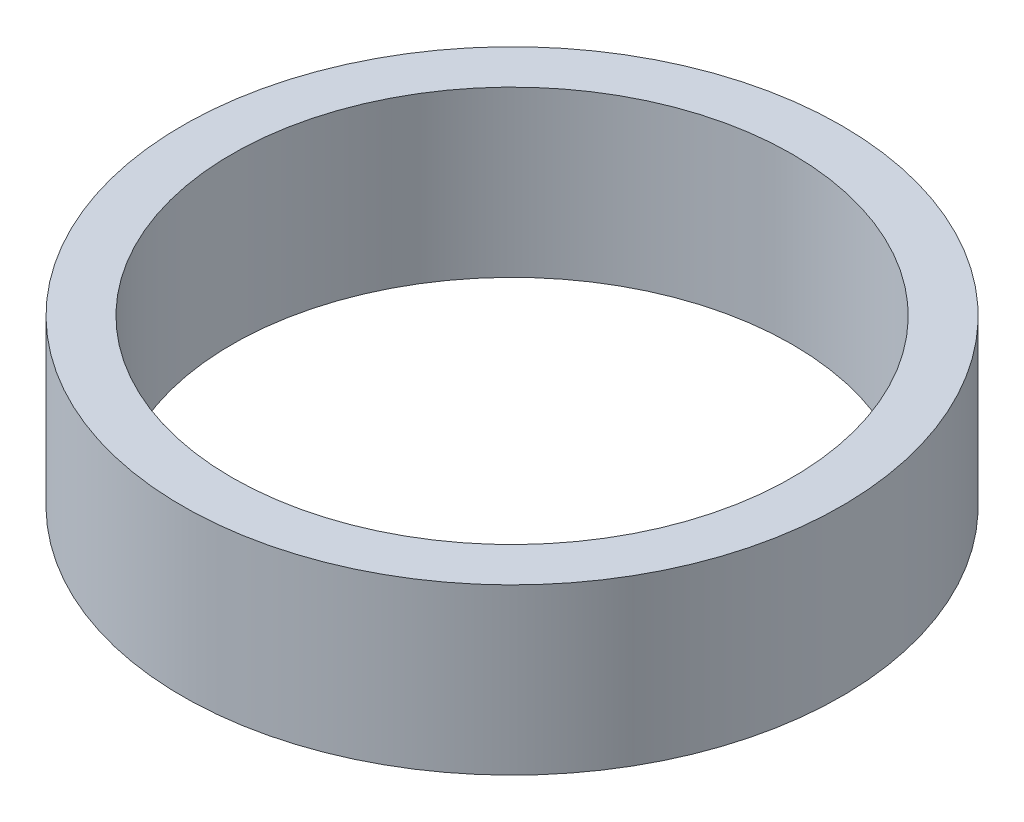
ISO-10303-21;
HEADER;
FILE_DESCRIPTION(('STEP AP214'),'2;1');
FILE_NAME('part.step','',(''),(''),'','','');
FILE_SCHEMA(('AUTOMOTIVE_DESIGN { 1 0 10303 214 1 1 1 1 }'));
ENDSEC;
DATA;
#1=APPLICATION_CONTEXT('core data for automotive mechanical design processes');
#2=APPLICATION_PROTOCOL_DEFINITION('international standard','automotive_design',2000,#1);
#3=PRODUCT_CONTEXT('',#1,'mechanical');
#4=PRODUCT('Part','Part','',(#3));
#5=PRODUCT_RELATED_PRODUCT_CATEGORY('part','',(#4));
#6=PRODUCT_DEFINITION_FORMATION('','',#4);
#7=PRODUCT_DEFINITION_CONTEXT('part definition',#1,'design');
#8=PRODUCT_DEFINITION('design','',#6,#7);
#9=PRODUCT_DEFINITION_SHAPE('','',#8);
#10=(LENGTH_UNIT() NAMED_UNIT(*) SI_UNIT(.MILLI.,.METRE.));
#11=(NAMED_UNIT(*) PLANE_ANGLE_UNIT() SI_UNIT($,.RADIAN.));
#12=(NAMED_UNIT(*) SI_UNIT($,.STERADIAN.) SOLID_ANGLE_UNIT());
#13=UNCERTAINTY_MEASURE_WITH_UNIT(LENGTH_MEASURE(1.E-05),#10,'distance_accuracy_value','');
#14=(GEOMETRIC_REPRESENTATION_CONTEXT(3) GLOBAL_UNCERTAINTY_ASSIGNED_CONTEXT((#13)) GLOBAL_UNIT_ASSIGNED_CONTEXT((#10,
#11,#12)) REPRESENTATION_CONTEXT('',''));
#15=CARTESIAN_POINT('',(0.,0.,0.));
#16=DIRECTION('',(0.,0.,1.));
#17=DIRECTION('',(1.,0.,0.));
#18=AXIS2_PLACEMENT_3D('',#15,#16,#17);
#19=CARTESIAN_POINT('',(0.,12.7,0.));
#20=DIRECTION('',(0.,-1.,0.));
#21=DIRECTION('',(0.,0.,-1.));
#22=AXIS2_PLACEMENT_3D('',#19,#20,#21);
#23=CYLINDRICAL_SURFACE('',#22,43.18);
#24=CARTESIAN_POINT('',(0.,-12.7,0.));
#25=DIRECTION('',(0.,-1.,0.));
#26=DIRECTION('',(0.,0.,-1.));
#27=AXIS2_PLACEMENT_3D('',#24,#25,#26);
#28=CIRCLE('',#27,43.18);
#29=CARTESIAN_POINT('',(0.,-12.7,-43.18));
#30=VERTEX_POINT('',#29);
#31=EDGE_CURVE('E27',#30,#30,#28,.T.);
#32=ORIENTED_EDGE('',*,*,#31,.T.);
#33=EDGE_LOOP('',(#32));
#34=FACE_BOUND('',#33,.T.);
#35=CARTESIAN_POINT('',(0.,12.7,0.));
#36=DIRECTION('',(0.,-1.,0.));
#37=DIRECTION('',(0.,0.,-1.));
#38=AXIS2_PLACEMENT_3D('',#35,#36,#37);
#39=CIRCLE('',#38,43.18);
#40=CARTESIAN_POINT('',(0.,12.7,-43.18));
#41=VERTEX_POINT('',#40);
#42=EDGE_CURVE('E18',#41,#41,#39,.T.);
#43=ORIENTED_EDGE('',*,*,#42,.F.);
#44=EDGE_LOOP('',(#43));
#45=FACE_BOUND('',#44,.T.);
#46=ADVANCED_FACE('F15',(#34,#45),#23,.F.);
#47=CARTESIAN_POINT('',(0.,12.7,0.));
#48=DIRECTION('',(0.,1.,0.));
#49=DIRECTION('',(0.,0.,1.));
#50=AXIS2_PLACEMENT_3D('',#47,#48,#49);
#51=PLANE('',#50);
#52=ORIENTED_EDGE('',*,*,#42,.T.);
#53=EDGE_LOOP('',(#52));
#54=FACE_BOUND('',#53,.T.);
#55=CARTESIAN_POINT('',(0.,12.7,0.));
#56=DIRECTION('',(0.,-1.,0.));
#57=DIRECTION('',(0.,0.,-1.));
#58=AXIS2_PLACEMENT_3D('',#55,#56,#57);
#59=CIRCLE('',#58,50.8);
#60=CARTESIAN_POINT('',(0.,12.7,-50.8));
#61=VERTEX_POINT('',#60);
#62=EDGE_CURVE('E22',#61,#61,#59,.T.);
#63=ORIENTED_EDGE('',*,*,#62,.F.);
#64=EDGE_LOOP('',(#63));
#65=FACE_BOUND('',#64,.T.);
#66=ADVANCED_FACE('F35',(#54,#65),#51,.T.);
#67=CARTESIAN_POINT('',(0.,-12.7,0.));
#68=DIRECTION('',(0.,1.,0.));
#69=DIRECTION('',(0.,0.,1.));
#70=AXIS2_PLACEMENT_3D('',#67,#68,#69);
#71=PLANE('',#70);
#72=ORIENTED_EDGE('',*,*,#31,.F.);
#73=EDGE_LOOP('',(#72));
#74=FACE_BOUND('',#73,.T.);
#75=CARTESIAN_POINT('',(0.,-12.7,0.));
#76=DIRECTION('',(0.,-1.,0.));
#77=DIRECTION('',(0.,0.,-1.));
#78=AXIS2_PLACEMENT_3D('',#75,#76,#77);
#79=CIRCLE('',#78,50.8);
#80=CARTESIAN_POINT('',(0.,-12.7,-50.8));
#81=VERTEX_POINT('',#80);
#82=EDGE_CURVE('E10',#81,#81,#79,.F.);
#83=ORIENTED_EDGE('',*,*,#82,.F.);
#84=EDGE_LOOP('',(#83));
#85=FACE_BOUND('',#84,.T.);
#86=ADVANCED_FACE('F43',(#74,#85),#71,.F.);
#87=CARTESIAN_POINT('',(0.,12.7,0.));
#88=DIRECTION('',(0.,-1.,0.));
#89=DIRECTION('',(0.,0.,-1.));
#90=AXIS2_PLACEMENT_3D('',#87,#88,#89);
#91=CYLINDRICAL_SURFACE('',#90,50.8);
#92=ORIENTED_EDGE('',*,*,#82,.T.);
#93=EDGE_LOOP('',(#92));
#94=FACE_BOUND('',#93,.T.);
#95=ORIENTED_EDGE('',*,*,#62,.T.);
#96=EDGE_LOOP('',(#95));
#97=FACE_BOUND('',#96,.T.);
#98=ADVANCED_FACE('F44',(#94,#97),#91,.T.);
#99=CLOSED_SHELL('',(#46,#66,#86,#98));
#100=MANIFOLD_SOLID_BREP('B1',#99);
#101=ADVANCED_BREP_SHAPE_REPRESENTATION('',(#18,#100),#14);
#102=SHAPE_DEFINITION_REPRESENTATION(#9,#101);
ENDSEC;
END-ISO-10303-21;
